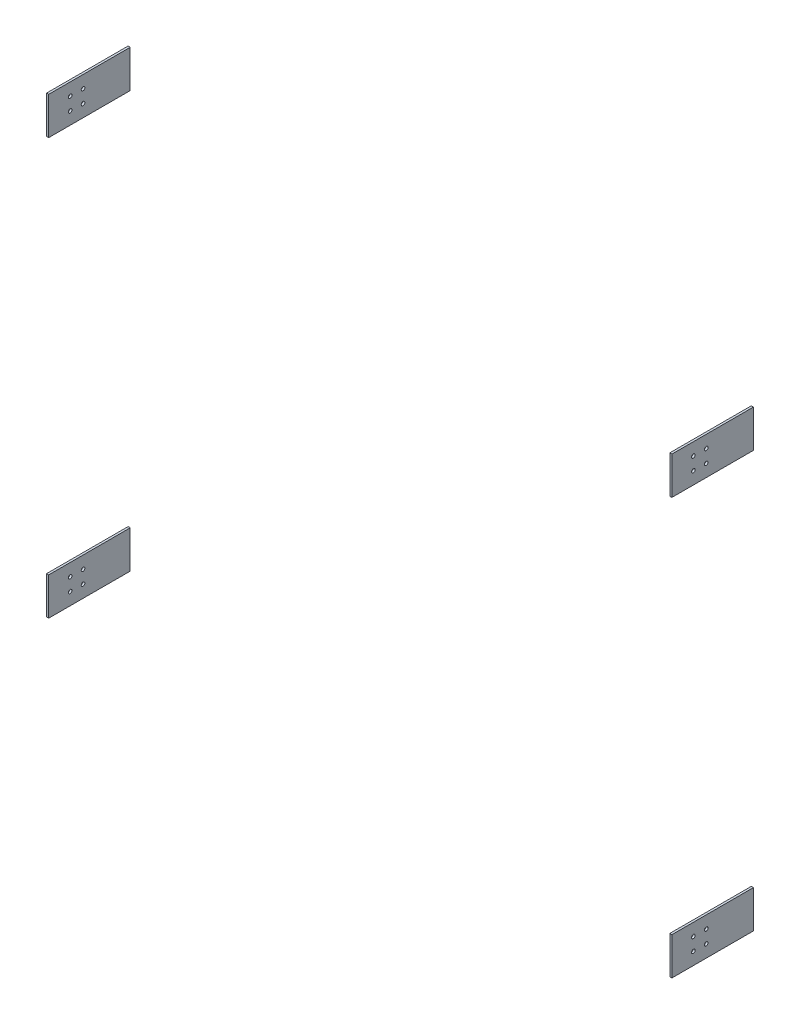
ISO-10303-21;
HEADER;
FILE_DESCRIPTION(('STEP AP214'),'2;1');
FILE_NAME('part.step','',(''),(''),'','','');
FILE_SCHEMA(('AUTOMOTIVE_DESIGN { 1 0 10303 214 1 1 1 1 }'));
ENDSEC;
DATA;
#1=APPLICATION_CONTEXT('core data for automotive mechanical design processes');
#2=APPLICATION_PROTOCOL_DEFINITION('international standard','automotive_design',2000,#1);
#3=PRODUCT_CONTEXT('',#1,'mechanical');
#4=PRODUCT('Part','Part','',(#3));
#5=PRODUCT_RELATED_PRODUCT_CATEGORY('part','',(#4));
#6=PRODUCT_DEFINITION_FORMATION('','',#4);
#7=PRODUCT_DEFINITION_CONTEXT('part definition',#1,'design');
#8=PRODUCT_DEFINITION('design','',#6,#7);
#9=PRODUCT_DEFINITION_SHAPE('','',#8);
#10=(LENGTH_UNIT() NAMED_UNIT(*) SI_UNIT(.MILLI.,.METRE.));
#11=(NAMED_UNIT(*) PLANE_ANGLE_UNIT() SI_UNIT($,.RADIAN.));
#12=(NAMED_UNIT(*) SI_UNIT($,.STERADIAN.) SOLID_ANGLE_UNIT());
#13=UNCERTAINTY_MEASURE_WITH_UNIT(LENGTH_MEASURE(1.E-05),#10,'distance_accuracy_value','');
#14=(GEOMETRIC_REPRESENTATION_CONTEXT(3) GLOBAL_UNCERTAINTY_ASSIGNED_CONTEXT((#13)) GLOBAL_UNIT_ASSIGNED_CONTEXT((#10,
#11,#12)) REPRESENTATION_CONTEXT('',''));
#15=CARTESIAN_POINT('',(0.,0.,0.));
#16=DIRECTION('',(0.,0.,1.));
#17=DIRECTION('',(1.,0.,0.));
#18=AXIS2_PLACEMENT_3D('',#15,#16,#17);
#19=CARTESIAN_POINT('',(-290.5,-194.,14.));
#20=DIRECTION('',(0.,0.,1.));
#21=DIRECTION('',(1.,0.,0.));
#22=AXIS2_PLACEMENT_3D('',#19,#20,#21);
#23=PLANE('',#22);
#24=DIRECTION('',(-1.,0.,0.));
#25=VECTOR('',#24,1.);
#26=CARTESIAN_POINT('',(-290.5,-211.5,14.));
#27=LINE('',#26,#25);
#28=CARTESIAN_POINT('',(-289.5,-211.5,14.));
#29=VERTEX_POINT('',#28);
#30=CARTESIAN_POINT('',(-291.5,-211.5,14.));
#31=VERTEX_POINT('',#30);
#32=EDGE_CURVE('P0_E11',#29,#31,#27,.T.);
#33=ORIENTED_EDGE('',*,*,#32,.F.);
#34=DIRECTION('',(0.,-1.,0.));
#35=VECTOR('',#34,1.);
#36=CARTESIAN_POINT('',(-289.5,-194.,14.));
#37=LINE('',#36,#35);
#38=CARTESIAN_POINT('',(-289.5,-176.5,14.));
#39=VERTEX_POINT('',#38);
#40=EDGE_CURVE('P0_E64',#39,#29,#37,.T.);
#41=ORIENTED_EDGE('',*,*,#40,.F.);
#42=DIRECTION('',(1.,0.,0.));
#43=VECTOR('',#42,1.);
#44=CARTESIAN_POINT('',(-290.5,-176.5,14.));
#45=LINE('',#44,#43);
#46=CARTESIAN_POINT('',(-291.5,-176.5,14.));
#47=VERTEX_POINT('',#46);
#48=EDGE_CURVE('P0_E103',#47,#39,#45,.T.);
#49=ORIENTED_EDGE('',*,*,#48,.F.);
#50=DIRECTION('',(0.,1.,0.));
#51=VECTOR('',#50,1.);
#52=CARTESIAN_POINT('',(-291.5,-194.,14.));
#53=LINE('',#52,#51);
#54=EDGE_CURVE('P0_E26',#31,#47,#53,.T.);
#55=ORIENTED_EDGE('',*,*,#54,.F.);
#56=EDGE_LOOP('',(#33,#41,#49,#55));
#57=FACE_BOUND('',#56,.T.);
#58=ADVANCED_FACE('P0_F17',(#57),#23,.T.);
#59=CARTESIAN_POINT('',(-290.5,-211.5,-62.));
#60=DIRECTION('',(0.,-1.,0.));
#61=DIRECTION('',(0.,0.,-1.));
#62=AXIS2_PLACEMENT_3D('',#59,#60,#61);
#63=PLANE('',#62);
#64=DIRECTION('',(0.,0.,1.));
#65=VECTOR('',#64,1.);
#66=CARTESIAN_POINT('',(-289.5,-211.5,-62.));
#67=LINE('',#66,#65);
#68=CARTESIAN_POINT('',(-289.5,-211.5,-62.));
#69=VERTEX_POINT('',#68);
#70=EDGE_CURVE('P0_E57',#69,#29,#67,.T.);
#71=ORIENTED_EDGE('',*,*,#70,.T.);
#72=ORIENTED_EDGE('',*,*,#32,.T.);
#73=DIRECTION('',(0.,0.,1.));
#74=VECTOR('',#73,1.);
#75=CARTESIAN_POINT('',(-291.5,-211.5,-62.));
#76=LINE('',#75,#74);
#77=CARTESIAN_POINT('',(-291.5,-211.5,-62.));
#78=VERTEX_POINT('',#77);
#79=EDGE_CURVE('P0_E71',#78,#31,#76,.T.);
#80=ORIENTED_EDGE('',*,*,#79,.F.);
#81=DIRECTION('',(1.,0.,0.));
#82=VECTOR('',#81,1.);
#83=CARTESIAN_POINT('',(-290.5,-211.5,-62.));
#84=LINE('',#83,#82);
#85=EDGE_CURVE('P0_E69',#78,#69,#84,.T.);
#86=ORIENTED_EDGE('',*,*,#85,.T.);
#87=EDGE_LOOP('',(#71,#72,#80,#86));
#88=FACE_BOUND('',#87,.T.);
#89=ADVANCED_FACE('P0_F70',(#88),#63,.T.);
#90=CARTESIAN_POINT('',(-291.5,-194.,-62.));
#91=DIRECTION('',(-1.,0.,0.));
#92=DIRECTION('',(0.,0.,1.));
#93=AXIS2_PLACEMENT_3D('',#90,#91,#92);
#94=PLANE('',#93);
#95=CARTESIAN_POINT('',(-291.5,-188.,-6.));
#96=DIRECTION('',(-1.,0.,0.));
#97=DIRECTION('',(0.,0.,1.));
#98=AXIS2_PLACEMENT_3D('',#95,#96,#97);
#99=CIRCLE('',#98,1.7);
#100=CARTESIAN_POINT('',(-291.5,-188.,-4.3));
#101=VERTEX_POINT('',#100);
#102=EDGE_CURVE('P0_E119',#101,#101,#99,.T.);
#103=ORIENTED_EDGE('',*,*,#102,.F.);
#104=EDGE_LOOP('',(#103));
#105=FACE_BOUND('',#104,.T.);
#106=CARTESIAN_POINT('',(-291.5,-188.,-18.));
#107=DIRECTION('',(-1.,0.,0.));
#108=DIRECTION('',(0.,0.,1.));
#109=AXIS2_PLACEMENT_3D('',#106,#107,#108);
#110=CIRCLE('',#109,1.7);
#111=CARTESIAN_POINT('',(-291.5,-188.,-16.3));
#112=VERTEX_POINT('',#111);
#113=EDGE_CURVE('P0_E115',#112,#112,#110,.T.);
#114=ORIENTED_EDGE('',*,*,#113,.F.);
#115=EDGE_LOOP('',(#114));
#116=FACE_BOUND('',#115,.T.);
#117=CARTESIAN_POINT('',(-291.5,-200.,-6.));
#118=DIRECTION('',(-1.,0.,0.));
#119=DIRECTION('',(0.,0.,1.));
#120=AXIS2_PLACEMENT_3D('',#117,#118,#119);
#121=CIRCLE('',#120,1.7);
#122=CARTESIAN_POINT('',(-291.5,-200.,-4.3));
#123=VERTEX_POINT('',#122);
#124=EDGE_CURVE('P0_E111',#123,#123,#121,.T.);
#125=ORIENTED_EDGE('',*,*,#124,.F.);
#126=EDGE_LOOP('',(#125));
#127=FACE_BOUND('',#126,.T.);
#128=CARTESIAN_POINT('',(-291.5,-200.,-18.));
#129=DIRECTION('',(-1.,0.,0.));
#130=DIRECTION('',(0.,0.,1.));
#131=AXIS2_PLACEMENT_3D('',#128,#129,#130);
#132=CIRCLE('',#131,1.7);
#133=CARTESIAN_POINT('',(-291.5,-200.,-16.3));
#134=VERTEX_POINT('',#133);
#135=EDGE_CURVE('P0_E77',#134,#134,#132,.T.);
#136=ORIENTED_EDGE('',*,*,#135,.F.);
#137=EDGE_LOOP('',(#136));
#138=FACE_BOUND('',#137,.T.);
#139=ORIENTED_EDGE('',*,*,#79,.T.);
#140=ORIENTED_EDGE('',*,*,#54,.T.);
#141=DIRECTION('',(0.,0.,1.));
#142=VECTOR('',#141,1.);
#143=CARTESIAN_POINT('',(-291.5,-176.5,-62.));
#144=LINE('',#143,#142);
#145=CARTESIAN_POINT('',(-291.5,-176.5,-62.));
#146=VERTEX_POINT('',#145);
#147=EDGE_CURVE('P0_E95',#146,#47,#144,.T.);
#148=ORIENTED_EDGE('',*,*,#147,.F.);
#149=DIRECTION('',(0.,-1.,0.));
#150=VECTOR('',#149,1.);
#151=CARTESIAN_POINT('',(-291.5,-194.,-62.));
#152=LINE('',#151,#150);
#153=EDGE_CURVE('P0_E76',#146,#78,#152,.T.);
#154=ORIENTED_EDGE('',*,*,#153,.T.);
#155=EDGE_LOOP('',(#139,#140,#148,#154));
#156=FACE_BOUND('',#155,.T.);
#157=ADVANCED_FACE('P0_F142',(#105,#116,#127,#138,#156),#94,.T.);
#158=CARTESIAN_POINT('',(-290.5,-176.5,-62.));
#159=DIRECTION('',(0.,1.,0.));
#160=DIRECTION('',(0.,0.,1.));
#161=AXIS2_PLACEMENT_3D('',#158,#159,#160);
#162=PLANE('',#161);
#163=ORIENTED_EDGE('',*,*,#147,.T.);
#164=ORIENTED_EDGE('',*,*,#48,.T.);
#165=DIRECTION('',(0.,0.,1.));
#166=VECTOR('',#165,1.);
#167=CARTESIAN_POINT('',(-289.5,-176.5,-62.));
#168=LINE('',#167,#166);
#169=CARTESIAN_POINT('',(-289.5,-176.5,-62.));
#170=VERTEX_POINT('',#169);
#171=EDGE_CURVE('P0_E66',#170,#39,#168,.T.);
#172=ORIENTED_EDGE('',*,*,#171,.F.);
#173=DIRECTION('',(-1.,0.,0.));
#174=VECTOR('',#173,1.);
#175=CARTESIAN_POINT('',(-290.5,-176.5,-62.));
#176=LINE('',#175,#174);
#177=EDGE_CURVE('P0_E82',#170,#146,#176,.T.);
#178=ORIENTED_EDGE('',*,*,#177,.T.);
#179=EDGE_LOOP('',(#163,#164,#172,#178));
#180=FACE_BOUND('',#179,.T.);
#181=ADVANCED_FACE('P0_F144',(#180),#162,.T.);
#182=CARTESIAN_POINT('',(-290.5,-194.,-62.));
#183=DIRECTION('',(0.,0.,-1.));
#184=DIRECTION('',(-1.,0.,0.));
#185=AXIS2_PLACEMENT_3D('',#182,#183,#184);
#186=PLANE('',#185);
#187=DIRECTION('',(0.,1.,0.));
#188=VECTOR('',#187,1.);
#189=CARTESIAN_POINT('',(-289.5,-194.,-62.));
#190=LINE('',#189,#188);
#191=EDGE_CURVE('P0_E62',#69,#170,#190,.T.);
#192=ORIENTED_EDGE('',*,*,#191,.F.);
#193=ORIENTED_EDGE('',*,*,#85,.F.);
#194=ORIENTED_EDGE('',*,*,#153,.F.);
#195=ORIENTED_EDGE('',*,*,#177,.F.);
#196=EDGE_LOOP('',(#192,#193,#194,#195));
#197=FACE_BOUND('',#196,.T.);
#198=ADVANCED_FACE('P0_F80',(#197),#186,.T.);
#199=CARTESIAN_POINT('',(-289.5,-194.,-62.));
#200=DIRECTION('',(1.,0.,0.));
#201=DIRECTION('',(0.,0.,-1.));
#202=AXIS2_PLACEMENT_3D('',#199,#200,#201);
#203=PLANE('',#202);
#204=CARTESIAN_POINT('',(-289.5,-188.,-6.));
#205=DIRECTION('',(1.,0.,0.));
#206=DIRECTION('',(0.,0.,-1.));
#207=AXIS2_PLACEMENT_3D('',#204,#205,#206);
#208=CIRCLE('',#207,1.7);
#209=CARTESIAN_POINT('',(-289.5,-188.,-7.7));
#210=VERTEX_POINT('',#209);
#211=EDGE_CURVE('P0_E20',#210,#210,#208,.T.);
#212=ORIENTED_EDGE('',*,*,#211,.F.);
#213=EDGE_LOOP('',(#212));
#214=FACE_BOUND('',#213,.T.);
#215=CARTESIAN_POINT('',(-289.5,-188.,-18.));
#216=DIRECTION('',(1.,0.,0.));
#217=DIRECTION('',(0.,0.,-1.));
#218=AXIS2_PLACEMENT_3D('',#215,#216,#217);
#219=CIRCLE('',#218,1.7);
#220=CARTESIAN_POINT('',(-289.5,-188.,-19.7));
#221=VERTEX_POINT('',#220);
#222=EDGE_CURVE('P0_E116',#221,#221,#219,.T.);
#223=ORIENTED_EDGE('',*,*,#222,.F.);
#224=EDGE_LOOP('',(#223));
#225=FACE_BOUND('',#224,.T.);
#226=CARTESIAN_POINT('',(-289.5,-200.,-6.));
#227=DIRECTION('',(1.,0.,0.));
#228=DIRECTION('',(0.,0.,-1.));
#229=AXIS2_PLACEMENT_3D('',#226,#227,#228);
#230=CIRCLE('',#229,1.7);
#231=CARTESIAN_POINT('',(-289.5,-200.,-7.7));
#232=VERTEX_POINT('',#231);
#233=EDGE_CURVE('P0_E112',#232,#232,#230,.T.);
#234=ORIENTED_EDGE('',*,*,#233,.F.);
#235=EDGE_LOOP('',(#234));
#236=FACE_BOUND('',#235,.T.);
#237=CARTESIAN_POINT('',(-289.5,-200.,-18.));
#238=DIRECTION('',(1.,0.,0.));
#239=DIRECTION('',(0.,0.,-1.));
#240=AXIS2_PLACEMENT_3D('',#237,#238,#239);
#241=CIRCLE('',#240,1.7);
#242=CARTESIAN_POINT('',(-289.5,-200.,-19.7));
#243=VERTEX_POINT('',#242);
#244=EDGE_CURVE('P0_E107',#243,#243,#241,.T.);
#245=ORIENTED_EDGE('',*,*,#244,.F.);
#246=EDGE_LOOP('',(#245));
#247=FACE_BOUND('',#246,.T.);
#248=ORIENTED_EDGE('',*,*,#191,.T.);
#249=ORIENTED_EDGE('',*,*,#171,.T.);
#250=ORIENTED_EDGE('',*,*,#40,.T.);
#251=ORIENTED_EDGE('',*,*,#70,.F.);
#252=EDGE_LOOP('',(#248,#249,#250,#251));
#253=FACE_BOUND('',#252,.T.);
#254=ADVANCED_FACE('P0_F59',(#214,#225,#236,#247,#253),#203,.T.);
#255=CARTESIAN_POINT('',(-289.2,-200.,-18.));
#256=DIRECTION('',(-1.,0.,0.));
#257=DIRECTION('',(0.,0.,1.));
#258=AXIS2_PLACEMENT_3D('',#255,#256,#257);
#259=CYLINDRICAL_SURFACE('',#258,1.7);
#260=ORIENTED_EDGE('',*,*,#135,.T.);
#261=EDGE_LOOP('',(#260));
#262=FACE_BOUND('',#261,.T.);
#263=ORIENTED_EDGE('',*,*,#244,.T.);
#264=EDGE_LOOP('',(#263));
#265=FACE_BOUND('',#264,.T.);
#266=ADVANCED_FACE('P0_F139',(#262,#265),#259,.F.);
#267=CARTESIAN_POINT('',(-289.2,-200.,-6.));
#268=DIRECTION('',(-1.,0.,0.));
#269=DIRECTION('',(0.,0.,1.));
#270=AXIS2_PLACEMENT_3D('',#267,#268,#269);
#271=CYLINDRICAL_SURFACE('',#270,1.7);
#272=ORIENTED_EDGE('',*,*,#124,.T.);
#273=EDGE_LOOP('',(#272));
#274=FACE_BOUND('',#273,.T.);
#275=ORIENTED_EDGE('',*,*,#233,.T.);
#276=EDGE_LOOP('',(#275));
#277=FACE_BOUND('',#276,.T.);
#278=ADVANCED_FACE('P0_F164',(#274,#277),#271,.F.);
#279=CARTESIAN_POINT('',(-289.2,-188.,-18.));
#280=DIRECTION('',(-1.,0.,0.));
#281=DIRECTION('',(0.,0.,1.));
#282=AXIS2_PLACEMENT_3D('',#279,#280,#281);
#283=CYLINDRICAL_SURFACE('',#282,1.7);
#284=ORIENTED_EDGE('',*,*,#113,.T.);
#285=EDGE_LOOP('',(#284));
#286=FACE_BOUND('',#285,.T.);
#287=ORIENTED_EDGE('',*,*,#222,.T.);
#288=EDGE_LOOP('',(#287));
#289=FACE_BOUND('',#288,.T.);
#290=ADVANCED_FACE('P0_F167',(#286,#289),#283,.F.);
#291=CARTESIAN_POINT('',(-289.2,-188.,-6.));
#292=DIRECTION('',(-1.,0.,0.));
#293=DIRECTION('',(0.,0.,1.));
#294=AXIS2_PLACEMENT_3D('',#291,#292,#293);
#295=CYLINDRICAL_SURFACE('',#294,1.7);
#296=ORIENTED_EDGE('',*,*,#102,.T.);
#297=EDGE_LOOP('',(#296));
#298=FACE_BOUND('',#297,.T.);
#299=ORIENTED_EDGE('',*,*,#211,.T.);
#300=EDGE_LOOP('',(#299));
#301=FACE_BOUND('',#300,.T.);
#302=ADVANCED_FACE('P0_F171',(#298,#301),#295,.F.);
#303=CLOSED_SHELL('',(#58,#89,#157,#181,#198,#254,#266,#278,#290,#302));
#304=MANIFOLD_SOLID_BREP('P0_B1',#303);
#305=CARTESIAN_POINT('',(-290.5,194.,14.));
#306=DIRECTION('',(0.,0.,1.));
#307=DIRECTION('',(1.,0.,0.));
#308=AXIS2_PLACEMENT_3D('',#305,#306,#307);
#309=PLANE('',#308);
#310=DIRECTION('',(-1.,0.,0.));
#311=VECTOR('',#310,1.);
#312=CARTESIAN_POINT('',(-290.5,176.5,14.));
#313=LINE('',#312,#311);
#314=CARTESIAN_POINT('',(-289.5,176.5,14.));
#315=VERTEX_POINT('',#314);
#316=CARTESIAN_POINT('',(-291.5,176.5,14.));
#317=VERTEX_POINT('',#316);
#318=EDGE_CURVE('P1_E11',#315,#317,#313,.T.);
#319=ORIENTED_EDGE('',*,*,#318,.F.);
#320=DIRECTION('',(0.,-1.,0.));
#321=VECTOR('',#320,1.);
#322=CARTESIAN_POINT('',(-289.5,194.,14.));
#323=LINE('',#322,#321);
#324=CARTESIAN_POINT('',(-289.5,211.5,14.));
#325=VERTEX_POINT('',#324);
#326=EDGE_CURVE('P1_E64',#325,#315,#323,.T.);
#327=ORIENTED_EDGE('',*,*,#326,.F.);
#328=DIRECTION('',(1.,0.,0.));
#329=VECTOR('',#328,1.);
#330=CARTESIAN_POINT('',(-290.5,211.5,14.));
#331=LINE('',#330,#329);
#332=CARTESIAN_POINT('',(-291.5,211.5,14.));
#333=VERTEX_POINT('',#332);
#334=EDGE_CURVE('P1_E103',#333,#325,#331,.T.);
#335=ORIENTED_EDGE('',*,*,#334,.F.);
#336=DIRECTION('',(0.,1.,0.));
#337=VECTOR('',#336,1.);
#338=CARTESIAN_POINT('',(-291.5,194.,14.));
#339=LINE('',#338,#337);
#340=EDGE_CURVE('P1_E26',#317,#333,#339,.T.);
#341=ORIENTED_EDGE('',*,*,#340,.F.);
#342=EDGE_LOOP('',(#319,#327,#335,#341));
#343=FACE_BOUND('',#342,.T.);
#344=ADVANCED_FACE('P1_F17',(#343),#309,.T.);
#345=CARTESIAN_POINT('',(-290.5,176.5,-62.));
#346=DIRECTION('',(0.,-1.,0.));
#347=DIRECTION('',(0.,0.,-1.));
#348=AXIS2_PLACEMENT_3D('',#345,#346,#347);
#349=PLANE('',#348);
#350=DIRECTION('',(0.,0.,1.));
#351=VECTOR('',#350,1.);
#352=CARTESIAN_POINT('',(-289.5,176.5,-62.));
#353=LINE('',#352,#351);
#354=CARTESIAN_POINT('',(-289.5,176.5,-62.));
#355=VERTEX_POINT('',#354);
#356=EDGE_CURVE('P1_E57',#355,#315,#353,.T.);
#357=ORIENTED_EDGE('',*,*,#356,.T.);
#358=ORIENTED_EDGE('',*,*,#318,.T.);
#359=DIRECTION('',(0.,0.,1.));
#360=VECTOR('',#359,1.);
#361=CARTESIAN_POINT('',(-291.5,176.5,-62.));
#362=LINE('',#361,#360);
#363=CARTESIAN_POINT('',(-291.5,176.5,-62.));
#364=VERTEX_POINT('',#363);
#365=EDGE_CURVE('P1_E71',#364,#317,#362,.T.);
#366=ORIENTED_EDGE('',*,*,#365,.F.);
#367=DIRECTION('',(1.,0.,0.));
#368=VECTOR('',#367,1.);
#369=CARTESIAN_POINT('',(-290.5,176.5,-62.));
#370=LINE('',#369,#368);
#371=EDGE_CURVE('P1_E69',#364,#355,#370,.T.);
#372=ORIENTED_EDGE('',*,*,#371,.T.);
#373=EDGE_LOOP('',(#357,#358,#366,#372));
#374=FACE_BOUND('',#373,.T.);
#375=ADVANCED_FACE('P1_F70',(#374),#349,.T.);
#376=CARTESIAN_POINT('',(-291.5,194.,-62.));
#377=DIRECTION('',(-1.,0.,0.));
#378=DIRECTION('',(0.,0.,1.));
#379=AXIS2_PLACEMENT_3D('',#376,#377,#378);
#380=PLANE('',#379);
#381=CARTESIAN_POINT('',(-291.5,200.,-6.));
#382=DIRECTION('',(-1.,0.,0.));
#383=DIRECTION('',(0.,0.,1.));
#384=AXIS2_PLACEMENT_3D('',#381,#382,#383);
#385=CIRCLE('',#384,1.7);
#386=CARTESIAN_POINT('',(-291.5,200.,-4.3));
#387=VERTEX_POINT('',#386);
#388=EDGE_CURVE('P1_E120',#387,#387,#385,.T.);
#389=ORIENTED_EDGE('',*,*,#388,.F.);
#390=EDGE_LOOP('',(#389));
#391=FACE_BOUND('',#390,.T.);
#392=CARTESIAN_POINT('',(-291.5,200.,-18.));
#393=DIRECTION('',(-1.,0.,0.));
#394=DIRECTION('',(0.,0.,1.));
#395=AXIS2_PLACEMENT_3D('',#392,#393,#394);
#396=CIRCLE('',#395,1.7);
#397=CARTESIAN_POINT('',(-291.5,200.,-16.3));
#398=VERTEX_POINT('',#397);
#399=EDGE_CURVE('P1_E116',#398,#398,#396,.T.);
#400=ORIENTED_EDGE('',*,*,#399,.F.);
#401=EDGE_LOOP('',(#400));
#402=FACE_BOUND('',#401,.T.);
#403=CARTESIAN_POINT('',(-291.5,188.,-6.));
#404=DIRECTION('',(-1.,0.,0.));
#405=DIRECTION('',(0.,0.,1.));
#406=AXIS2_PLACEMENT_3D('',#403,#404,#405);
#407=CIRCLE('',#406,1.7);
#408=CARTESIAN_POINT('',(-291.5,188.,-4.3));
#409=VERTEX_POINT('',#408);
#410=EDGE_CURVE('P1_E112',#409,#409,#407,.T.);
#411=ORIENTED_EDGE('',*,*,#410,.F.);
#412=EDGE_LOOP('',(#411));
#413=FACE_BOUND('',#412,.T.);
#414=CARTESIAN_POINT('',(-291.5,188.,-18.));
#415=DIRECTION('',(-1.,0.,0.));
#416=DIRECTION('',(0.,0.,1.));
#417=AXIS2_PLACEMENT_3D('',#414,#415,#416);
#418=CIRCLE('',#417,1.7);
#419=CARTESIAN_POINT('',(-291.5,188.,-16.3));
#420=VERTEX_POINT('',#419);
#421=EDGE_CURVE('P1_E77',#420,#420,#418,.T.);
#422=ORIENTED_EDGE('',*,*,#421,.F.);
#423=EDGE_LOOP('',(#422));
#424=FACE_BOUND('',#423,.T.);
#425=ORIENTED_EDGE('',*,*,#365,.T.);
#426=ORIENTED_EDGE('',*,*,#340,.T.);
#427=DIRECTION('',(0.,0.,1.));
#428=VECTOR('',#427,1.);
#429=CARTESIAN_POINT('',(-291.5,211.5,-62.));
#430=LINE('',#429,#428);
#431=CARTESIAN_POINT('',(-291.5,211.5,-62.));
#432=VERTEX_POINT('',#431);
#433=EDGE_CURVE('P1_E95',#432,#333,#430,.T.);
#434=ORIENTED_EDGE('',*,*,#433,.F.);
#435=DIRECTION('',(0.,-1.,0.));
#436=VECTOR('',#435,1.);
#437=CARTESIAN_POINT('',(-291.5,194.,-62.));
#438=LINE('',#437,#436);
#439=EDGE_CURVE('P1_E76',#432,#364,#438,.T.);
#440=ORIENTED_EDGE('',*,*,#439,.T.);
#441=EDGE_LOOP('',(#425,#426,#434,#440));
#442=FACE_BOUND('',#441,.T.);
#443=ADVANCED_FACE('P1_F142',(#391,#402,#413,#424,#442),#380,.T.);
#444=CARTESIAN_POINT('',(-290.5,211.5,-62.));
#445=DIRECTION('',(0.,1.,0.));
#446=DIRECTION('',(0.,0.,1.));
#447=AXIS2_PLACEMENT_3D('',#444,#445,#446);
#448=PLANE('',#447);
#449=ORIENTED_EDGE('',*,*,#433,.T.);
#450=ORIENTED_EDGE('',*,*,#334,.T.);
#451=DIRECTION('',(0.,0.,1.));
#452=VECTOR('',#451,1.);
#453=CARTESIAN_POINT('',(-289.5,211.5,-62.));
#454=LINE('',#453,#452);
#455=CARTESIAN_POINT('',(-289.5,211.5,-62.));
#456=VERTEX_POINT('',#455);
#457=EDGE_CURVE('P1_E66',#456,#325,#454,.T.);
#458=ORIENTED_EDGE('',*,*,#457,.F.);
#459=DIRECTION('',(-1.,0.,0.));
#460=VECTOR('',#459,1.);
#461=CARTESIAN_POINT('',(-290.5,211.5,-62.));
#462=LINE('',#461,#460);
#463=EDGE_CURVE('P1_E82',#456,#432,#462,.T.);
#464=ORIENTED_EDGE('',*,*,#463,.T.);
#465=EDGE_LOOP('',(#449,#450,#458,#464));
#466=FACE_BOUND('',#465,.T.);
#467=ADVANCED_FACE('P1_F144',(#466),#448,.T.);
#468=CARTESIAN_POINT('',(-290.5,194.,-62.));
#469=DIRECTION('',(0.,0.,-1.));
#470=DIRECTION('',(-1.,0.,0.));
#471=AXIS2_PLACEMENT_3D('',#468,#469,#470);
#472=PLANE('',#471);
#473=DIRECTION('',(0.,1.,0.));
#474=VECTOR('',#473,1.);
#475=CARTESIAN_POINT('',(-289.5,194.,-62.));
#476=LINE('',#475,#474);
#477=EDGE_CURVE('P1_E62',#355,#456,#476,.T.);
#478=ORIENTED_EDGE('',*,*,#477,.F.);
#479=ORIENTED_EDGE('',*,*,#371,.F.);
#480=ORIENTED_EDGE('',*,*,#439,.F.);
#481=ORIENTED_EDGE('',*,*,#463,.F.);
#482=EDGE_LOOP('',(#478,#479,#480,#481));
#483=FACE_BOUND('',#482,.T.);
#484=ADVANCED_FACE('P1_F80',(#483),#472,.T.);
#485=CARTESIAN_POINT('',(-289.5,194.,-62.));
#486=DIRECTION('',(1.,0.,0.));
#487=DIRECTION('',(0.,0.,-1.));
#488=AXIS2_PLACEMENT_3D('',#485,#486,#487);
#489=PLANE('',#488);
#490=CARTESIAN_POINT('',(-289.5,200.,-6.));
#491=DIRECTION('',(1.,0.,0.));
#492=DIRECTION('',(0.,0.,-1.));
#493=AXIS2_PLACEMENT_3D('',#490,#491,#492);
#494=CIRCLE('',#493,1.7);
#495=CARTESIAN_POINT('',(-289.5,200.,-7.7));
#496=VERTEX_POINT('',#495);
#497=EDGE_CURVE('P1_E20',#496,#496,#494,.T.);
#498=ORIENTED_EDGE('',*,*,#497,.F.);
#499=EDGE_LOOP('',(#498));
#500=FACE_BOUND('',#499,.T.);
#501=CARTESIAN_POINT('',(-289.5,200.,-18.));
#502=DIRECTION('',(1.,0.,0.));
#503=DIRECTION('',(0.,0.,-1.));
#504=AXIS2_PLACEMENT_3D('',#501,#502,#503);
#505=CIRCLE('',#504,1.7);
#506=CARTESIAN_POINT('',(-289.5,200.,-19.7));
#507=VERTEX_POINT('',#506);
#508=EDGE_CURVE('P1_E117',#507,#507,#505,.T.);
#509=ORIENTED_EDGE('',*,*,#508,.F.);
#510=EDGE_LOOP('',(#509));
#511=FACE_BOUND('',#510,.T.);
#512=CARTESIAN_POINT('',(-289.5,188.,-6.));
#513=DIRECTION('',(1.,0.,0.));
#514=DIRECTION('',(0.,0.,-1.));
#515=AXIS2_PLACEMENT_3D('',#512,#513,#514);
#516=CIRCLE('',#515,1.7);
#517=CARTESIAN_POINT('',(-289.5,188.,-7.7));
#518=VERTEX_POINT('',#517);
#519=EDGE_CURVE('P1_E113',#518,#518,#516,.T.);
#520=ORIENTED_EDGE('',*,*,#519,.F.);
#521=EDGE_LOOP('',(#520));
#522=FACE_BOUND('',#521,.T.);
#523=CARTESIAN_POINT('',(-289.5,188.,-18.));
#524=DIRECTION('',(1.,0.,0.));
#525=DIRECTION('',(0.,0.,-1.));
#526=AXIS2_PLACEMENT_3D('',#523,#524,#525);
#527=CIRCLE('',#526,1.7);
#528=CARTESIAN_POINT('',(-289.5,188.,-19.7));
#529=VERTEX_POINT('',#528);
#530=EDGE_CURVE('P1_E108',#529,#529,#527,.T.);
#531=ORIENTED_EDGE('',*,*,#530,.F.);
#532=EDGE_LOOP('',(#531));
#533=FACE_BOUND('',#532,.T.);
#534=ORIENTED_EDGE('',*,*,#477,.T.);
#535=ORIENTED_EDGE('',*,*,#457,.T.);
#536=ORIENTED_EDGE('',*,*,#326,.T.);
#537=ORIENTED_EDGE('',*,*,#356,.F.);
#538=EDGE_LOOP('',(#534,#535,#536,#537));
#539=FACE_BOUND('',#538,.T.);
#540=ADVANCED_FACE('P1_F59',(#500,#511,#522,#533,#539),#489,.T.);
#541=CARTESIAN_POINT('',(-289.2,188.,-18.));
#542=DIRECTION('',(-1.,0.,0.));
#543=DIRECTION('',(0.,0.,1.));
#544=AXIS2_PLACEMENT_3D('',#541,#542,#543);
#545=CYLINDRICAL_SURFACE('',#544,1.7);
#546=ORIENTED_EDGE('',*,*,#421,.T.);
#547=EDGE_LOOP('',(#546));
#548=FACE_BOUND('',#547,.T.);
#549=ORIENTED_EDGE('',*,*,#530,.T.);
#550=EDGE_LOOP('',(#549));
#551=FACE_BOUND('',#550,.T.);
#552=ADVANCED_FACE('P1_F139',(#548,#551),#545,.F.);
#553=CARTESIAN_POINT('',(-289.2,188.,-6.));
#554=DIRECTION('',(-1.,0.,0.));
#555=DIRECTION('',(0.,0.,1.));
#556=AXIS2_PLACEMENT_3D('',#553,#554,#555);
#557=CYLINDRICAL_SURFACE('',#556,1.7);
#558=ORIENTED_EDGE('',*,*,#410,.T.);
#559=EDGE_LOOP('',(#558));
#560=FACE_BOUND('',#559,.T.);
#561=ORIENTED_EDGE('',*,*,#519,.T.);
#562=EDGE_LOOP('',(#561));
#563=FACE_BOUND('',#562,.T.);
#564=ADVANCED_FACE('P1_F164',(#560,#563),#557,.F.);
#565=CARTESIAN_POINT('',(-289.2,200.,-18.));
#566=DIRECTION('',(-1.,0.,0.));
#567=DIRECTION('',(0.,0.,1.));
#568=AXIS2_PLACEMENT_3D('',#565,#566,#567);
#569=CYLINDRICAL_SURFACE('',#568,1.7);
#570=ORIENTED_EDGE('',*,*,#399,.T.);
#571=EDGE_LOOP('',(#570));
#572=FACE_BOUND('',#571,.T.);
#573=ORIENTED_EDGE('',*,*,#508,.T.);
#574=EDGE_LOOP('',(#573));
#575=FACE_BOUND('',#574,.T.);
#576=ADVANCED_FACE('P1_F167',(#572,#575),#569,.F.);
#577=CARTESIAN_POINT('',(-289.2,200.,-6.));
#578=DIRECTION('',(-1.,0.,0.));
#579=DIRECTION('',(0.,0.,1.));
#580=AXIS2_PLACEMENT_3D('',#577,#578,#579);
#581=CYLINDRICAL_SURFACE('',#580,1.7);
#582=ORIENTED_EDGE('',*,*,#388,.T.);
#583=EDGE_LOOP('',(#582));
#584=FACE_BOUND('',#583,.T.);
#585=ORIENTED_EDGE('',*,*,#497,.T.);
#586=EDGE_LOOP('',(#585));
#587=FACE_BOUND('',#586,.T.);
#588=ADVANCED_FACE('P1_F171',(#584,#587),#581,.F.);
#589=CLOSED_SHELL('',(#344,#375,#443,#467,#484,#540,#552,#564,#576,#588));
#590=MANIFOLD_SOLID_BREP('P1_B1',#589);
#591=CARTESIAN_POINT('',(290.5,-194.,14.));
#592=DIRECTION('',(0.,0.,1.));
#593=DIRECTION('',(1.,0.,0.));
#594=AXIS2_PLACEMENT_3D('',#591,#592,#593);
#595=PLANE('',#594);
#596=DIRECTION('',(-1.,0.,0.));
#597=VECTOR('',#596,1.);
#598=CARTESIAN_POINT('',(290.5,-211.5,14.));
#599=LINE('',#598,#597);
#600=CARTESIAN_POINT('',(291.5,-211.5,14.));
#601=VERTEX_POINT('',#600);
#602=CARTESIAN_POINT('',(289.5,-211.5,14.));
#603=VERTEX_POINT('',#602);
#604=EDGE_CURVE('P2_E11',#601,#603,#599,.T.);
#605=ORIENTED_EDGE('',*,*,#604,.F.);
#606=DIRECTION('',(0.,-1.,0.));
#607=VECTOR('',#606,1.);
#608=CARTESIAN_POINT('',(291.5,-194.,14.));
#609=LINE('',#608,#607);
#610=CARTESIAN_POINT('',(291.5,-176.5,14.));
#611=VERTEX_POINT('',#610);
#612=EDGE_CURVE('P2_E64',#611,#601,#609,.T.);
#613=ORIENTED_EDGE('',*,*,#612,.F.);
#614=DIRECTION('',(1.,0.,0.));
#615=VECTOR('',#614,1.);
#616=CARTESIAN_POINT('',(290.5,-176.5,14.));
#617=LINE('',#616,#615);
#618=CARTESIAN_POINT('',(289.5,-176.5,14.));
#619=VERTEX_POINT('',#618);
#620=EDGE_CURVE('P2_E103',#619,#611,#617,.T.);
#621=ORIENTED_EDGE('',*,*,#620,.F.);
#622=DIRECTION('',(0.,1.,0.));
#623=VECTOR('',#622,1.);
#624=CARTESIAN_POINT('',(289.5,-194.,14.));
#625=LINE('',#624,#623);
#626=EDGE_CURVE('P2_E26',#603,#619,#625,.T.);
#627=ORIENTED_EDGE('',*,*,#626,.F.);
#628=EDGE_LOOP('',(#605,#613,#621,#627));
#629=FACE_BOUND('',#628,.T.);
#630=ADVANCED_FACE('P2_F17',(#629),#595,.T.);
#631=CARTESIAN_POINT('',(290.5,-211.5,-62.));
#632=DIRECTION('',(0.,-1.,0.));
#633=DIRECTION('',(0.,0.,-1.));
#634=AXIS2_PLACEMENT_3D('',#631,#632,#633);
#635=PLANE('',#634);
#636=DIRECTION('',(0.,0.,1.));
#637=VECTOR('',#636,1.);
#638=CARTESIAN_POINT('',(291.5,-211.5,-62.));
#639=LINE('',#638,#637);
#640=CARTESIAN_POINT('',(291.5,-211.5,-62.));
#641=VERTEX_POINT('',#640);
#642=EDGE_CURVE('P2_E57',#641,#601,#639,.T.);
#643=ORIENTED_EDGE('',*,*,#642,.T.);
#644=ORIENTED_EDGE('',*,*,#604,.T.);
#645=DIRECTION('',(0.,0.,1.));
#646=VECTOR('',#645,1.);
#647=CARTESIAN_POINT('',(289.5,-211.5,-62.));
#648=LINE('',#647,#646);
#649=CARTESIAN_POINT('',(289.5,-211.5,-62.));
#650=VERTEX_POINT('',#649);
#651=EDGE_CURVE('P2_E71',#650,#603,#648,.T.);
#652=ORIENTED_EDGE('',*,*,#651,.F.);
#653=DIRECTION('',(1.,0.,0.));
#654=VECTOR('',#653,1.);
#655=CARTESIAN_POINT('',(290.5,-211.5,-62.));
#656=LINE('',#655,#654);
#657=EDGE_CURVE('P2_E69',#650,#641,#656,.T.);
#658=ORIENTED_EDGE('',*,*,#657,.T.);
#659=EDGE_LOOP('',(#643,#644,#652,#658));
#660=FACE_BOUND('',#659,.T.);
#661=ADVANCED_FACE('P2_F70',(#660),#635,.T.);
#662=CARTESIAN_POINT('',(289.5,-194.,-62.));
#663=DIRECTION('',(-1.,0.,0.));
#664=DIRECTION('',(0.,0.,1.));
#665=AXIS2_PLACEMENT_3D('',#662,#663,#664);
#666=PLANE('',#665);
#667=CARTESIAN_POINT('',(289.5,-188.,-6.));
#668=DIRECTION('',(-1.,0.,0.));
#669=DIRECTION('',(0.,0.,1.));
#670=AXIS2_PLACEMENT_3D('',#667,#668,#669);
#671=CIRCLE('',#670,1.7);
#672=CARTESIAN_POINT('',(289.5,-188.,-4.3));
#673=VERTEX_POINT('',#672);
#674=EDGE_CURVE('P2_E120',#673,#673,#671,.T.);
#675=ORIENTED_EDGE('',*,*,#674,.F.);
#676=EDGE_LOOP('',(#675));
#677=FACE_BOUND('',#676,.T.);
#678=CARTESIAN_POINT('',(289.5,-188.,-18.));
#679=DIRECTION('',(-1.,0.,0.));
#680=DIRECTION('',(0.,0.,1.));
#681=AXIS2_PLACEMENT_3D('',#678,#679,#680);
#682=CIRCLE('',#681,1.7);
#683=CARTESIAN_POINT('',(289.5,-188.,-16.3));
#684=VERTEX_POINT('',#683);
#685=EDGE_CURVE('P2_E116',#684,#684,#682,.T.);
#686=ORIENTED_EDGE('',*,*,#685,.F.);
#687=EDGE_LOOP('',(#686));
#688=FACE_BOUND('',#687,.T.);
#689=CARTESIAN_POINT('',(289.5,-200.,-6.));
#690=DIRECTION('',(-1.,0.,0.));
#691=DIRECTION('',(0.,0.,1.));
#692=AXIS2_PLACEMENT_3D('',#689,#690,#691);
#693=CIRCLE('',#692,1.7);
#694=CARTESIAN_POINT('',(289.5,-200.,-4.3));
#695=VERTEX_POINT('',#694);
#696=EDGE_CURVE('P2_E112',#695,#695,#693,.T.);
#697=ORIENTED_EDGE('',*,*,#696,.F.);
#698=EDGE_LOOP('',(#697));
#699=FACE_BOUND('',#698,.T.);
#700=CARTESIAN_POINT('',(289.5,-200.,-18.));
#701=DIRECTION('',(-1.,0.,0.));
#702=DIRECTION('',(0.,0.,1.));
#703=AXIS2_PLACEMENT_3D('',#700,#701,#702);
#704=CIRCLE('',#703,1.7);
#705=CARTESIAN_POINT('',(289.5,-200.,-16.3));
#706=VERTEX_POINT('',#705);
#707=EDGE_CURVE('P2_E77',#706,#706,#704,.T.);
#708=ORIENTED_EDGE('',*,*,#707,.F.);
#709=EDGE_LOOP('',(#708));
#710=FACE_BOUND('',#709,.T.);
#711=ORIENTED_EDGE('',*,*,#651,.T.);
#712=ORIENTED_EDGE('',*,*,#626,.T.);
#713=DIRECTION('',(0.,0.,1.));
#714=VECTOR('',#713,1.);
#715=CARTESIAN_POINT('',(289.5,-176.5,-62.));
#716=LINE('',#715,#714);
#717=CARTESIAN_POINT('',(289.5,-176.5,-62.));
#718=VERTEX_POINT('',#717);
#719=EDGE_CURVE('P2_E96',#718,#619,#716,.T.);
#720=ORIENTED_EDGE('',*,*,#719,.F.);
#721=DIRECTION('',(0.,-1.,0.));
#722=VECTOR('',#721,1.);
#723=CARTESIAN_POINT('',(289.5,-194.,-62.));
#724=LINE('',#723,#722);
#725=EDGE_CURVE('P2_E76',#718,#650,#724,.T.);
#726=ORIENTED_EDGE('',*,*,#725,.T.);
#727=EDGE_LOOP('',(#711,#712,#720,#726));
#728=FACE_BOUND('',#727,.T.);
#729=ADVANCED_FACE('P2_F142',(#677,#688,#699,#710,#728),#666,.T.);
#730=CARTESIAN_POINT('',(290.5,-176.5,-62.));
#731=DIRECTION('',(0.,1.,0.));
#732=DIRECTION('',(0.,0.,1.));
#733=AXIS2_PLACEMENT_3D('',#730,#731,#732);
#734=PLANE('',#733);
#735=ORIENTED_EDGE('',*,*,#719,.T.);
#736=ORIENTED_EDGE('',*,*,#620,.T.);
#737=DIRECTION('',(0.,0.,1.));
#738=VECTOR('',#737,1.);
#739=CARTESIAN_POINT('',(291.5,-176.5,-62.));
#740=LINE('',#739,#738);
#741=CARTESIAN_POINT('',(291.5,-176.5,-62.));
#742=VERTEX_POINT('',#741);
#743=EDGE_CURVE('P2_E66',#742,#611,#740,.T.);
#744=ORIENTED_EDGE('',*,*,#743,.F.);
#745=DIRECTION('',(-1.,0.,0.));
#746=VECTOR('',#745,1.);
#747=CARTESIAN_POINT('',(290.5,-176.5,-62.));
#748=LINE('',#747,#746);
#749=EDGE_CURVE('P2_E82',#742,#718,#748,.T.);
#750=ORIENTED_EDGE('',*,*,#749,.T.);
#751=EDGE_LOOP('',(#735,#736,#744,#750));
#752=FACE_BOUND('',#751,.T.);
#753=ADVANCED_FACE('P2_F144',(#752),#734,.T.);
#754=CARTESIAN_POINT('',(290.5,-194.,-62.));
#755=DIRECTION('',(0.,0.,-1.));
#756=DIRECTION('',(-1.,0.,0.));
#757=AXIS2_PLACEMENT_3D('',#754,#755,#756);
#758=PLANE('',#757);
#759=DIRECTION('',(0.,1.,0.));
#760=VECTOR('',#759,1.);
#761=CARTESIAN_POINT('',(291.5,-194.,-62.));
#762=LINE('',#761,#760);
#763=EDGE_CURVE('P2_E62',#641,#742,#762,.T.);
#764=ORIENTED_EDGE('',*,*,#763,.F.);
#765=ORIENTED_EDGE('',*,*,#657,.F.);
#766=ORIENTED_EDGE('',*,*,#725,.F.);
#767=ORIENTED_EDGE('',*,*,#749,.F.);
#768=EDGE_LOOP('',(#764,#765,#766,#767));
#769=FACE_BOUND('',#768,.T.);
#770=ADVANCED_FACE('P2_F80',(#769),#758,.T.);
#771=CARTESIAN_POINT('',(291.5,-194.,-62.));
#772=DIRECTION('',(1.,0.,0.));
#773=DIRECTION('',(0.,0.,-1.));
#774=AXIS2_PLACEMENT_3D('',#771,#772,#773);
#775=PLANE('',#774);
#776=CARTESIAN_POINT('',(291.5,-188.,-6.));
#777=DIRECTION('',(1.,0.,0.));
#778=DIRECTION('',(0.,0.,-1.));
#779=AXIS2_PLACEMENT_3D('',#776,#777,#778);
#780=CIRCLE('',#779,1.7);
#781=CARTESIAN_POINT('',(291.5,-188.,-7.7));
#782=VERTEX_POINT('',#781);
#783=EDGE_CURVE('P2_E20',#782,#782,#780,.T.);
#784=ORIENTED_EDGE('',*,*,#783,.F.);
#785=EDGE_LOOP('',(#784));
#786=FACE_BOUND('',#785,.T.);
#787=CARTESIAN_POINT('',(291.5,-188.,-18.));
#788=DIRECTION('',(1.,0.,0.));
#789=DIRECTION('',(0.,0.,-1.));
#790=AXIS2_PLACEMENT_3D('',#787,#788,#789);
#791=CIRCLE('',#790,1.7);
#792=CARTESIAN_POINT('',(291.5,-188.,-19.7));
#793=VERTEX_POINT('',#792);
#794=EDGE_CURVE('P2_E117',#793,#793,#791,.T.);
#795=ORIENTED_EDGE('',*,*,#794,.F.);
#796=EDGE_LOOP('',(#795));
#797=FACE_BOUND('',#796,.T.);
#798=CARTESIAN_POINT('',(291.5,-200.,-6.));
#799=DIRECTION('',(1.,0.,0.));
#800=DIRECTION('',(0.,0.,-1.));
#801=AXIS2_PLACEMENT_3D('',#798,#799,#800);
#802=CIRCLE('',#801,1.7);
#803=CARTESIAN_POINT('',(291.5,-200.,-7.7));
#804=VERTEX_POINT('',#803);
#805=EDGE_CURVE('P2_E113',#804,#804,#802,.T.);
#806=ORIENTED_EDGE('',*,*,#805,.F.);
#807=EDGE_LOOP('',(#806));
#808=FACE_BOUND('',#807,.T.);
#809=CARTESIAN_POINT('',(291.5,-200.,-18.));
#810=DIRECTION('',(1.,0.,0.));
#811=DIRECTION('',(0.,0.,-1.));
#812=AXIS2_PLACEMENT_3D('',#809,#810,#811);
#813=CIRCLE('',#812,1.7);
#814=CARTESIAN_POINT('',(291.5,-200.,-19.7));
#815=VERTEX_POINT('',#814);
#816=EDGE_CURVE('P2_E108',#815,#815,#813,.T.);
#817=ORIENTED_EDGE('',*,*,#816,.F.);
#818=EDGE_LOOP('',(#817));
#819=FACE_BOUND('',#818,.T.);
#820=ORIENTED_EDGE('',*,*,#763,.T.);
#821=ORIENTED_EDGE('',*,*,#743,.T.);
#822=ORIENTED_EDGE('',*,*,#612,.T.);
#823=ORIENTED_EDGE('',*,*,#642,.F.);
#824=EDGE_LOOP('',(#820,#821,#822,#823));
#825=FACE_BOUND('',#824,.T.);
#826=ADVANCED_FACE('P2_F59',(#786,#797,#808,#819,#825),#775,.T.);
#827=CARTESIAN_POINT('',(289.2,-200.,-18.));
#828=DIRECTION('',(1.,0.,0.));
#829=DIRECTION('',(0.,0.,-1.));
#830=AXIS2_PLACEMENT_3D('',#827,#828,#829);
#831=CYLINDRICAL_SURFACE('',#830,1.7);
#832=ORIENTED_EDGE('',*,*,#707,.T.);
#833=EDGE_LOOP('',(#832));
#834=FACE_BOUND('',#833,.T.);
#835=ORIENTED_EDGE('',*,*,#816,.T.);
#836=EDGE_LOOP('',(#835));
#837=FACE_BOUND('',#836,.T.);
#838=ADVANCED_FACE('P2_F139',(#834,#837),#831,.F.);
#839=CARTESIAN_POINT('',(289.2,-200.,-6.));
#840=DIRECTION('',(1.,0.,0.));
#841=DIRECTION('',(0.,0.,-1.));
#842=AXIS2_PLACEMENT_3D('',#839,#840,#841);
#843=CYLINDRICAL_SURFACE('',#842,1.7);
#844=ORIENTED_EDGE('',*,*,#696,.T.);
#845=EDGE_LOOP('',(#844));
#846=FACE_BOUND('',#845,.T.);
#847=ORIENTED_EDGE('',*,*,#805,.T.);
#848=EDGE_LOOP('',(#847));
#849=FACE_BOUND('',#848,.T.);
#850=ADVANCED_FACE('P2_F164',(#846,#849),#843,.F.);
#851=CARTESIAN_POINT('',(289.2,-188.,-18.));
#852=DIRECTION('',(1.,0.,0.));
#853=DIRECTION('',(0.,0.,-1.));
#854=AXIS2_PLACEMENT_3D('',#851,#852,#853);
#855=CYLINDRICAL_SURFACE('',#854,1.7);
#856=ORIENTED_EDGE('',*,*,#685,.T.);
#857=EDGE_LOOP('',(#856));
#858=FACE_BOUND('',#857,.T.);
#859=ORIENTED_EDGE('',*,*,#794,.T.);
#860=EDGE_LOOP('',(#859));
#861=FACE_BOUND('',#860,.T.);
#862=ADVANCED_FACE('P2_F167',(#858,#861),#855,.F.);
#863=CARTESIAN_POINT('',(289.2,-188.,-6.));
#864=DIRECTION('',(1.,0.,0.));
#865=DIRECTION('',(0.,0.,-1.));
#866=AXIS2_PLACEMENT_3D('',#863,#864,#865);
#867=CYLINDRICAL_SURFACE('',#866,1.7);
#868=ORIENTED_EDGE('',*,*,#674,.T.);
#869=EDGE_LOOP('',(#868));
#870=FACE_BOUND('',#869,.T.);
#871=ORIENTED_EDGE('',*,*,#783,.T.);
#872=EDGE_LOOP('',(#871));
#873=FACE_BOUND('',#872,.T.);
#874=ADVANCED_FACE('P2_F171',(#870,#873),#867,.F.);
#875=CLOSED_SHELL('',(#630,#661,#729,#753,#770,#826,#838,#850,#862,#874));
#876=MANIFOLD_SOLID_BREP('P2_B1',#875);
#877=CARTESIAN_POINT('',(290.5,194.,14.));
#878=DIRECTION('',(0.,0.,1.));
#879=DIRECTION('',(1.,0.,0.));
#880=AXIS2_PLACEMENT_3D('',#877,#878,#879);
#881=PLANE('',#880);
#882=DIRECTION('',(-1.,0.,0.));
#883=VECTOR('',#882,1.);
#884=CARTESIAN_POINT('',(290.5,176.5,14.));
#885=LINE('',#884,#883);
#886=CARTESIAN_POINT('',(291.5,176.5,14.));
#887=VERTEX_POINT('',#886);
#888=CARTESIAN_POINT('',(289.5,176.5,14.));
#889=VERTEX_POINT('',#888);
#890=EDGE_CURVE('P3_E11',#887,#889,#885,.T.);
#891=ORIENTED_EDGE('',*,*,#890,.F.);
#892=DIRECTION('',(0.,-1.,0.));
#893=VECTOR('',#892,1.);
#894=CARTESIAN_POINT('',(291.5,194.,14.));
#895=LINE('',#894,#893);
#896=CARTESIAN_POINT('',(291.5,211.5,14.));
#897=VERTEX_POINT('',#896);
#898=EDGE_CURVE('P3_E64',#897,#887,#895,.T.);
#899=ORIENTED_EDGE('',*,*,#898,.F.);
#900=DIRECTION('',(1.,0.,0.));
#901=VECTOR('',#900,1.);
#902=CARTESIAN_POINT('',(290.5,211.5,14.));
#903=LINE('',#902,#901);
#904=CARTESIAN_POINT('',(289.5,211.5,14.));
#905=VERTEX_POINT('',#904);
#906=EDGE_CURVE('P3_E103',#905,#897,#903,.T.);
#907=ORIENTED_EDGE('',*,*,#906,.F.);
#908=DIRECTION('',(0.,1.,0.));
#909=VECTOR('',#908,1.);
#910=CARTESIAN_POINT('',(289.5,194.,14.));
#911=LINE('',#910,#909);
#912=EDGE_CURVE('P3_E26',#889,#905,#911,.T.);
#913=ORIENTED_EDGE('',*,*,#912,.F.);
#914=EDGE_LOOP('',(#891,#899,#907,#913));
#915=FACE_BOUND('',#914,.T.);
#916=ADVANCED_FACE('P3_F17',(#915),#881,.T.);
#917=CARTESIAN_POINT('',(290.5,176.5,-62.));
#918=DIRECTION('',(0.,-1.,0.));
#919=DIRECTION('',(0.,0.,-1.));
#920=AXIS2_PLACEMENT_3D('',#917,#918,#919);
#921=PLANE('',#920);
#922=DIRECTION('',(0.,0.,1.));
#923=VECTOR('',#922,1.);
#924=CARTESIAN_POINT('',(291.5,176.5,-62.));
#925=LINE('',#924,#923);
#926=CARTESIAN_POINT('',(291.5,176.5,-62.));
#927=VERTEX_POINT('',#926);
#928=EDGE_CURVE('P3_E57',#927,#887,#925,.T.);
#929=ORIENTED_EDGE('',*,*,#928,.T.);
#930=ORIENTED_EDGE('',*,*,#890,.T.);
#931=DIRECTION('',(0.,0.,1.));
#932=VECTOR('',#931,1.);
#933=CARTESIAN_POINT('',(289.5,176.5,-62.));
#934=LINE('',#933,#932);
#935=CARTESIAN_POINT('',(289.5,176.5,-62.));
#936=VERTEX_POINT('',#935);
#937=EDGE_CURVE('P3_E71',#936,#889,#934,.T.);
#938=ORIENTED_EDGE('',*,*,#937,.F.);
#939=DIRECTION('',(1.,0.,0.));
#940=VECTOR('',#939,1.);
#941=CARTESIAN_POINT('',(290.5,176.5,-62.));
#942=LINE('',#941,#940);
#943=EDGE_CURVE('P3_E69',#936,#927,#942,.T.);
#944=ORIENTED_EDGE('',*,*,#943,.T.);
#945=EDGE_LOOP('',(#929,#930,#938,#944));
#946=FACE_BOUND('',#945,.T.);
#947=ADVANCED_FACE('P3_F70',(#946),#921,.T.);
#948=CARTESIAN_POINT('',(289.5,194.,-62.));
#949=DIRECTION('',(-1.,0.,0.));
#950=DIRECTION('',(0.,0.,1.));
#951=AXIS2_PLACEMENT_3D('',#948,#949,#950);
#952=PLANE('',#951);
#953=CARTESIAN_POINT('',(289.5,200.,-6.));
#954=DIRECTION('',(-1.,0.,0.));
#955=DIRECTION('',(0.,0.,1.));
#956=AXIS2_PLACEMENT_3D('',#953,#954,#955);
#957=CIRCLE('',#956,1.7);
#958=CARTESIAN_POINT('',(289.5,200.,-4.3));
#959=VERTEX_POINT('',#958);
#960=EDGE_CURVE('P3_E120',#959,#959,#957,.T.);
#961=ORIENTED_EDGE('',*,*,#960,.F.);
#962=EDGE_LOOP('',(#961));
#963=FACE_BOUND('',#962,.T.);
#964=CARTESIAN_POINT('',(289.5,200.,-18.));
#965=DIRECTION('',(-1.,0.,0.));
#966=DIRECTION('',(0.,0.,1.));
#967=AXIS2_PLACEMENT_3D('',#964,#965,#966);
#968=CIRCLE('',#967,1.7);
#969=CARTESIAN_POINT('',(289.5,200.,-16.3));
#970=VERTEX_POINT('',#969);
#971=EDGE_CURVE('P3_E116',#970,#970,#968,.T.);
#972=ORIENTED_EDGE('',*,*,#971,.F.);
#973=EDGE_LOOP('',(#972));
#974=FACE_BOUND('',#973,.T.);
#975=CARTESIAN_POINT('',(289.5,188.,-6.));
#976=DIRECTION('',(-1.,0.,0.));
#977=DIRECTION('',(0.,0.,1.));
#978=AXIS2_PLACEMENT_3D('',#975,#976,#977);
#979=CIRCLE('',#978,1.7);
#980=CARTESIAN_POINT('',(289.5,188.,-4.3));
#981=VERTEX_POINT('',#980);
#982=EDGE_CURVE('P3_E112',#981,#981,#979,.T.);
#983=ORIENTED_EDGE('',*,*,#982,.F.);
#984=EDGE_LOOP('',(#983));
#985=FACE_BOUND('',#984,.T.);
#986=CARTESIAN_POINT('',(289.5,188.,-18.));
#987=DIRECTION('',(-1.,0.,0.));
#988=DIRECTION('',(0.,0.,1.));
#989=AXIS2_PLACEMENT_3D('',#986,#987,#988);
#990=CIRCLE('',#989,1.7);
#991=CARTESIAN_POINT('',(289.5,188.,-16.3));
#992=VERTEX_POINT('',#991);
#993=EDGE_CURVE('P3_E77',#992,#992,#990,.T.);
#994=ORIENTED_EDGE('',*,*,#993,.F.);
#995=EDGE_LOOP('',(#994));
#996=FACE_BOUND('',#995,.T.);
#997=ORIENTED_EDGE('',*,*,#937,.T.);
#998=ORIENTED_EDGE('',*,*,#912,.T.);
#999=DIRECTION('',(0.,0.,1.));
#1000=VECTOR('',#999,1.);
#1001=CARTESIAN_POINT('',(289.5,211.5,-62.));
#1002=LINE('',#1001,#1000);
#1003=CARTESIAN_POINT('',(289.5,211.5,-62.));
#1004=VERTEX_POINT('',#1003);
#1005=EDGE_CURVE('P3_E95',#1004,#905,#1002,.T.);
#1006=ORIENTED_EDGE('',*,*,#1005,.F.);
#1007=DIRECTION('',(0.,-1.,0.));
#1008=VECTOR('',#1007,1.);
#1009=CARTESIAN_POINT('',(289.5,194.,-62.));
#1010=LINE('',#1009,#1008);
#1011=EDGE_CURVE('P3_E76',#1004,#936,#1010,.T.);
#1012=ORIENTED_EDGE('',*,*,#1011,.T.);
#1013=EDGE_LOOP('',(#997,#998,#1006,#1012));
#1014=FACE_BOUND('',#1013,.T.);
#1015=ADVANCED_FACE('P3_F142',(#963,#974,#985,#996,#1014),#952,.T.);
#1016=CARTESIAN_POINT('',(290.5,211.5,-62.));
#1017=DIRECTION('',(0.,1.,0.));
#1018=DIRECTION('',(0.,0.,1.));
#1019=AXIS2_PLACEMENT_3D('',#1016,#1017,#1018);
#1020=PLANE('',#1019);
#1021=ORIENTED_EDGE('',*,*,#1005,.T.);
#1022=ORIENTED_EDGE('',*,*,#906,.T.);
#1023=DIRECTION('',(0.,0.,1.));
#1024=VECTOR('',#1023,1.);
#1025=CARTESIAN_POINT('',(291.5,211.5,-62.));
#1026=LINE('',#1025,#1024);
#1027=CARTESIAN_POINT('',(291.5,211.5,-62.));
#1028=VERTEX_POINT('',#1027);
#1029=EDGE_CURVE('P3_E66',#1028,#897,#1026,.T.);
#1030=ORIENTED_EDGE('',*,*,#1029,.F.);
#1031=DIRECTION('',(-1.,0.,0.));
#1032=VECTOR('',#1031,1.);
#1033=CARTESIAN_POINT('',(290.5,211.5,-62.));
#1034=LINE('',#1033,#1032);
#1035=EDGE_CURVE('P3_E82',#1028,#1004,#1034,.T.);
#1036=ORIENTED_EDGE('',*,*,#1035,.T.);
#1037=EDGE_LOOP('',(#1021,#1022,#1030,#1036));
#1038=FACE_BOUND('',#1037,.T.);
#1039=ADVANCED_FACE('P3_F144',(#1038),#1020,.T.);
#1040=CARTESIAN_POINT('',(290.5,194.,-62.));
#1041=DIRECTION('',(0.,0.,-1.));
#1042=DIRECTION('',(-1.,0.,0.));
#1043=AXIS2_PLACEMENT_3D('',#1040,#1041,#1042);
#1044=PLANE('',#1043);
#1045=DIRECTION('',(0.,1.,0.));
#1046=VECTOR('',#1045,1.);
#1047=CARTESIAN_POINT('',(291.5,194.,-62.));
#1048=LINE('',#1047,#1046);
#1049=EDGE_CURVE('P3_E62',#927,#1028,#1048,.T.);
#1050=ORIENTED_EDGE('',*,*,#1049,.F.);
#1051=ORIENTED_EDGE('',*,*,#943,.F.);
#1052=ORIENTED_EDGE('',*,*,#1011,.F.);
#1053=ORIENTED_EDGE('',*,*,#1035,.F.);
#1054=EDGE_LOOP('',(#1050,#1051,#1052,#1053));
#1055=FACE_BOUND('',#1054,.T.);
#1056=ADVANCED_FACE('P3_F80',(#1055),#1044,.T.);
#1057=CARTESIAN_POINT('',(291.5,194.,-62.));
#1058=DIRECTION('',(1.,0.,0.));
#1059=DIRECTION('',(0.,0.,-1.));
#1060=AXIS2_PLACEMENT_3D('',#1057,#1058,#1059);
#1061=PLANE('',#1060);
#1062=CARTESIAN_POINT('',(291.5,200.,-6.));
#1063=DIRECTION('',(1.,0.,0.));
#1064=DIRECTION('',(0.,0.,-1.));
#1065=AXIS2_PLACEMENT_3D('',#1062,#1063,#1064);
#1066=CIRCLE('',#1065,1.7);
#1067=CARTESIAN_POINT('',(291.5,200.,-7.7));
#1068=VERTEX_POINT('',#1067);
#1069=EDGE_CURVE('P3_E20',#1068,#1068,#1066,.T.);
#1070=ORIENTED_EDGE('',*,*,#1069,.F.);
#1071=EDGE_LOOP('',(#1070));
#1072=FACE_BOUND('',#1071,.T.);
#1073=CARTESIAN_POINT('',(291.5,200.,-18.));
#1074=DIRECTION('',(1.,0.,0.));
#1075=DIRECTION('',(0.,0.,-1.));
#1076=AXIS2_PLACEMENT_3D('',#1073,#1074,#1075);
#1077=CIRCLE('',#1076,1.7);
#1078=CARTESIAN_POINT('',(291.5,200.,-19.7));
#1079=VERTEX_POINT('',#1078);
#1080=EDGE_CURVE('P3_E117',#1079,#1079,#1077,.T.);
#1081=ORIENTED_EDGE('',*,*,#1080,.F.);
#1082=EDGE_LOOP('',(#1081));
#1083=FACE_BOUND('',#1082,.T.);
#1084=CARTESIAN_POINT('',(291.5,188.,-6.));
#1085=DIRECTION('',(1.,0.,0.));
#1086=DIRECTION('',(0.,0.,-1.));
#1087=AXIS2_PLACEMENT_3D('',#1084,#1085,#1086);
#1088=CIRCLE('',#1087,1.7);
#1089=CARTESIAN_POINT('',(291.5,188.,-7.7));
#1090=VERTEX_POINT('',#1089);
#1091=EDGE_CURVE('P3_E113',#1090,#1090,#1088,.T.);
#1092=ORIENTED_EDGE('',*,*,#1091,.F.);
#1093=EDGE_LOOP('',(#1092));
#1094=FACE_BOUND('',#1093,.T.);
#1095=CARTESIAN_POINT('',(291.5,188.,-18.));
#1096=DIRECTION('',(1.,0.,0.));
#1097=DIRECTION('',(0.,0.,-1.));
#1098=AXIS2_PLACEMENT_3D('',#1095,#1096,#1097);
#1099=CIRCLE('',#1098,1.7);
#1100=CARTESIAN_POINT('',(291.5,188.,-19.7));
#1101=VERTEX_POINT('',#1100);
#1102=EDGE_CURVE('P3_E108',#1101,#1101,#1099,.T.);
#1103=ORIENTED_EDGE('',*,*,#1102,.F.);
#1104=EDGE_LOOP('',(#1103));
#1105=FACE_BOUND('',#1104,.T.);
#1106=ORIENTED_EDGE('',*,*,#1049,.T.);
#1107=ORIENTED_EDGE('',*,*,#1029,.T.);
#1108=ORIENTED_EDGE('',*,*,#898,.T.);
#1109=ORIENTED_EDGE('',*,*,#928,.F.);
#1110=EDGE_LOOP('',(#1106,#1107,#1108,#1109));
#1111=FACE_BOUND('',#1110,.T.);
#1112=ADVANCED_FACE('P3_F59',(#1072,#1083,#1094,#1105,#1111),#1061,.T.);
#1113=CARTESIAN_POINT('',(289.2,188.,-18.));
#1114=DIRECTION('',(1.,0.,0.));
#1115=DIRECTION('',(0.,0.,-1.));
#1116=AXIS2_PLACEMENT_3D('',#1113,#1114,#1115);
#1117=CYLINDRICAL_SURFACE('',#1116,1.7);
#1118=ORIENTED_EDGE('',*,*,#993,.T.);
#1119=EDGE_LOOP('',(#1118));
#1120=FACE_BOUND('',#1119,.T.);
#1121=ORIENTED_EDGE('',*,*,#1102,.T.);
#1122=EDGE_LOOP('',(#1121));
#1123=FACE_BOUND('',#1122,.T.);
#1124=ADVANCED_FACE('P3_F139',(#1120,#1123),#1117,.F.);
#1125=CARTESIAN_POINT('',(289.2,188.,-6.));
#1126=DIRECTION('',(1.,0.,0.));
#1127=DIRECTION('',(0.,0.,-1.));
#1128=AXIS2_PLACEMENT_3D('',#1125,#1126,#1127);
#1129=CYLINDRICAL_SURFACE('',#1128,1.7);
#1130=ORIENTED_EDGE('',*,*,#982,.T.);
#1131=EDGE_LOOP('',(#1130));
#1132=FACE_BOUND('',#1131,.T.);
#1133=ORIENTED_EDGE('',*,*,#1091,.T.);
#1134=EDGE_LOOP('',(#1133));
#1135=FACE_BOUND('',#1134,.T.);
#1136=ADVANCED_FACE('P3_F164',(#1132,#1135),#1129,.F.);
#1137=CARTESIAN_POINT('',(289.2,200.,-18.));
#1138=DIRECTION('',(1.,0.,0.));
#1139=DIRECTION('',(0.,0.,-1.));
#1140=AXIS2_PLACEMENT_3D('',#1137,#1138,#1139);
#1141=CYLINDRICAL_SURFACE('',#1140,1.7);
#1142=ORIENTED_EDGE('',*,*,#971,.T.);
#1143=EDGE_LOOP('',(#1142));
#1144=FACE_BOUND('',#1143,.T.);
#1145=ORIENTED_EDGE('',*,*,#1080,.T.);
#1146=EDGE_LOOP('',(#1145));
#1147=FACE_BOUND('',#1146,.T.);
#1148=ADVANCED_FACE('P3_F167',(#1144,#1147),#1141,.F.);
#1149=CARTESIAN_POINT('',(289.2,200.,-6.));
#1150=DIRECTION('',(1.,0.,0.));
#1151=DIRECTION('',(0.,0.,-1.));
#1152=AXIS2_PLACEMENT_3D('',#1149,#1150,#1151);
#1153=CYLINDRICAL_SURFACE('',#1152,1.7);
#1154=ORIENTED_EDGE('',*,*,#960,.T.);
#1155=EDGE_LOOP('',(#1154));
#1156=FACE_BOUND('',#1155,.T.);
#1157=ORIENTED_EDGE('',*,*,#1069,.T.);
#1158=EDGE_LOOP('',(#1157));
#1159=FACE_BOUND('',#1158,.T.);
#1160=ADVANCED_FACE('P3_F171',(#1156,#1159),#1153,.F.);
#1161=CLOSED_SHELL('',(#916,#947,#1015,#1039,#1056,#1112,#1124,#1136,#1148,#1160));
#1162=MANIFOLD_SOLID_BREP('P3_B1',#1161);
#1163=ADVANCED_BREP_SHAPE_REPRESENTATION('',(#18,#304,#590,#876,#1162),#14);
#1164=SHAPE_DEFINITION_REPRESENTATION(#9,#1163);
ENDSEC;
END-ISO-10303-21;
